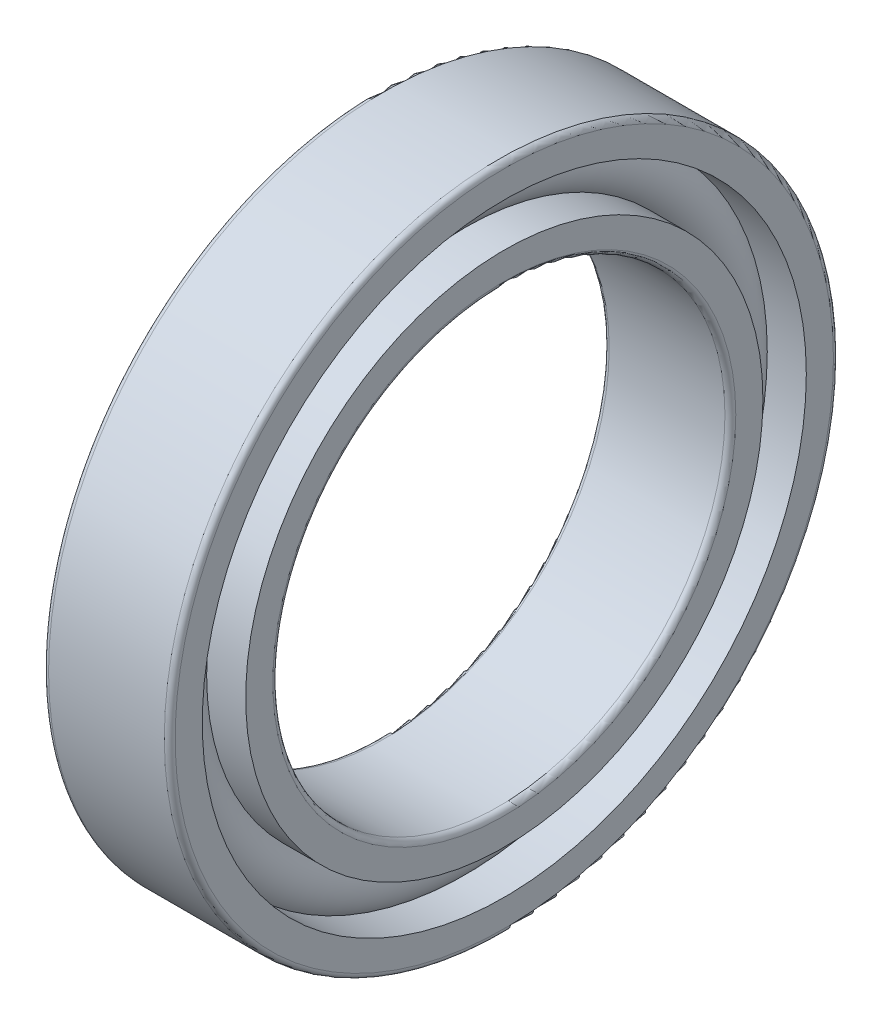
ISO-10303-21;
HEADER;
FILE_DESCRIPTION(('STEP AP214'),'2;1');
FILE_NAME('part.step','',(''),(''),'','','');
FILE_SCHEMA(('AUTOMOTIVE_DESIGN { 1 0 10303 214 1 1 1 1 }'));
ENDSEC;
DATA;
#1=APPLICATION_CONTEXT('core data for automotive mechanical design processes');
#2=APPLICATION_PROTOCOL_DEFINITION('international standard','automotive_design',2000,#1);
#3=PRODUCT_CONTEXT('',#1,'mechanical');
#4=PRODUCT('Part','Part','',(#3));
#5=PRODUCT_RELATED_PRODUCT_CATEGORY('part','',(#4));
#6=PRODUCT_DEFINITION_FORMATION('','',#4);
#7=PRODUCT_DEFINITION_CONTEXT('part definition',#1,'design');
#8=PRODUCT_DEFINITION('design','',#6,#7);
#9=PRODUCT_DEFINITION_SHAPE('','',#8);
#10=(LENGTH_UNIT() NAMED_UNIT(*) SI_UNIT(.MILLI.,.METRE.));
#11=(NAMED_UNIT(*) PLANE_ANGLE_UNIT() SI_UNIT($,.RADIAN.));
#12=(NAMED_UNIT(*) SI_UNIT($,.STERADIAN.) SOLID_ANGLE_UNIT());
#13=UNCERTAINTY_MEASURE_WITH_UNIT(LENGTH_MEASURE(1.E-05),#10,'distance_accuracy_value','');
#14=(GEOMETRIC_REPRESENTATION_CONTEXT(3) GLOBAL_UNCERTAINTY_ASSIGNED_CONTEXT((#13)) GLOBAL_UNIT_ASSIGNED_CONTEXT((#10,
#11,#12)) REPRESENTATION_CONTEXT('',''));
#15=CARTESIAN_POINT('',(0.,0.,0.));
#16=DIRECTION('',(0.,0.,1.));
#17=DIRECTION('',(1.,0.,0.));
#18=AXIS2_PLACEMENT_3D('',#15,#16,#17);
#19=CARTESIAN_POINT('',(0.,0.,0.));
#20=DIRECTION('',(-1.,0.,0.));
#21=DIRECTION('',(0.,0.,1.));
#22=AXIS2_PLACEMENT_3D('',#19,#20,#21);
#23=TOROIDAL_SURFACE('',#22,15.5,1.8);
#24=CARTESIAN_POINT('',(1.34164078649987,0.,0.));
#25=DIRECTION('',(-1.,0.,0.));
#26=DIRECTION('',(0.,0.,1.));
#27=AXIS2_PLACEMENT_3D('',#24,#25,#26);
#28=CIRCLE('',#27,16.7);
#29=CARTESIAN_POINT('',(1.34164078649987,0.,16.7));
#30=VERTEX_POINT('',#29);
#31=EDGE_CURVE('E34',#30,#30,#28,.F.);
#32=ORIENTED_EDGE('',*,*,#31,.T.);
#33=EDGE_LOOP('',(#32));
#34=FACE_BOUND('',#33,.T.);
#35=CARTESIAN_POINT('',(1.34164078649987,0.,0.));
#36=DIRECTION('',(-1.,0.,0.));
#37=DIRECTION('',(0.,0.,1.));
#38=AXIS2_PLACEMENT_3D('',#35,#36,#37);
#39=CIRCLE('',#38,14.3);
#40=CARTESIAN_POINT('',(1.34164078649987,0.,14.3));
#41=VERTEX_POINT('',#40);
#42=EDGE_CURVE('E10',#41,#41,#39,.T.);
#43=ORIENTED_EDGE('',*,*,#42,.T.);
#44=EDGE_LOOP('',(#43));
#45=FACE_BOUND('',#44,.T.);
#46=ADVANCED_FACE('F30',(#34,#45),#23,.T.);
#47=CARTESIAN_POINT('',(-20.6375,0.,0.));
#48=DIRECTION('',(1.,0.,0.));
#49=DIRECTION('',(0.,0.,-1.));
#50=AXIS2_PLACEMENT_3D('',#47,#48,#49);
#51=CYLINDRICAL_SURFACE('',#50,14.3);
#52=CARTESIAN_POINT('',(3.5,0.,0.));
#53=DIRECTION('',(1.,0.,0.));
#54=DIRECTION('',(0.,0.,-1.));
#55=AXIS2_PLACEMENT_3D('',#52,#53,#54);
#56=CIRCLE('',#55,14.3);
#57=CARTESIAN_POINT('',(3.5,0.,-14.3));
#58=VERTEX_POINT('',#57);
#59=EDGE_CURVE('E43',#58,#58,#56,.T.);
#60=ORIENTED_EDGE('',*,*,#59,.F.);
#61=EDGE_LOOP('',(#60));
#62=FACE_BOUND('',#61,.T.);
#63=ORIENTED_EDGE('',*,*,#42,.F.);
#64=EDGE_LOOP('',(#63));
#65=FACE_BOUND('',#64,.T.);
#66=ADVANCED_FACE('F82',(#62,#65),#51,.T.);
#67=CARTESIAN_POINT('',(-20.6375,0.,0.));
#68=DIRECTION('',(1.,0.,0.));
#69=DIRECTION('',(0.,0.,-1.));
#70=AXIS2_PLACEMENT_3D('',#67,#68,#69);
#71=CYLINDRICAL_SURFACE('',#70,14.3);
#72=CARTESIAN_POINT('',(-3.5,0.,0.));
#73=DIRECTION('',(1.,0.,0.));
#74=DIRECTION('',(0.,0.,-1.));
#75=AXIS2_PLACEMENT_3D('',#72,#73,#74);
#76=CIRCLE('',#75,14.3);
#77=CARTESIAN_POINT('',(-3.5,0.,-14.3));
#78=VERTEX_POINT('',#77);
#79=EDGE_CURVE('E52',#78,#78,#76,.T.);
#80=ORIENTED_EDGE('',*,*,#79,.T.);
#81=EDGE_LOOP('',(#80));
#82=FACE_BOUND('',#81,.T.);
#83=CARTESIAN_POINT('',(-1.34164078649987,0.,0.));
#84=DIRECTION('',(1.,0.,0.));
#85=DIRECTION('',(0.,0.,-1.));
#86=AXIS2_PLACEMENT_3D('',#83,#84,#85);
#87=CIRCLE('',#86,14.3);
#88=CARTESIAN_POINT('',(-1.34164078649987,0.,-14.3));
#89=VERTEX_POINT('',#88);
#90=EDGE_CURVE('E38',#89,#89,#87,.T.);
#91=ORIENTED_EDGE('',*,*,#90,.F.);
#92=EDGE_LOOP('',(#91));
#93=FACE_BOUND('',#92,.T.);
#94=ADVANCED_FACE('F85',(#82,#93),#71,.T.);
#95=CARTESIAN_POINT('',(3.5,12.8,0.));
#96=DIRECTION('',(1.,0.,0.));
#97=DIRECTION('',(0.,0.,-1.));
#98=AXIS2_PLACEMENT_3D('',#95,#96,#97);
#99=PLANE('',#98);
#100=ORIENTED_EDGE('',*,*,#59,.T.);
#101=EDGE_LOOP('',(#100));
#102=FACE_BOUND('',#101,.T.);
#103=CARTESIAN_POINT('',(3.5,0.,0.));
#104=DIRECTION('',(1.,0.,0.));
#105=DIRECTION('',(0.,0.,-1.));
#106=AXIS2_PLACEMENT_3D('',#103,#104,#105);
#107=CIRCLE('',#106,12.8);
#108=CARTESIAN_POINT('',(3.5,0.,-12.8));
#109=VERTEX_POINT('',#108);
#110=EDGE_CURVE('E74',#109,#109,#107,.T.);
#111=ORIENTED_EDGE('',*,*,#110,.F.);
#112=EDGE_LOOP('',(#111));
#113=FACE_BOUND('',#112,.T.);
#114=ADVANCED_FACE('F79',(#102,#113),#99,.T.);
#115=CARTESIAN_POINT('',(3.2,0.,0.));
#116=DIRECTION('',(1.,0.,0.));
#117=DIRECTION('',(0.,0.,-1.));
#118=AXIS2_PLACEMENT_3D('',#115,#116,#117);
#119=TOROIDAL_SURFACE('',#118,12.8,0.299999999999999);
#120=ORIENTED_EDGE('',*,*,#110,.T.);
#121=EDGE_LOOP('',(#120));
#122=FACE_BOUND('',#121,.T.);
#123=CARTESIAN_POINT('',(3.2,0.,0.));
#124=DIRECTION('',(1.,0.,0.));
#125=DIRECTION('',(0.,0.,-1.));
#126=AXIS2_PLACEMENT_3D('',#123,#124,#125);
#127=CIRCLE('',#126,12.5);
#128=CARTESIAN_POINT('',(3.2,0.,-12.5));
#129=VERTEX_POINT('',#128);
#130=EDGE_CURVE('E71',#129,#129,#127,.T.);
#131=ORIENTED_EDGE('',*,*,#130,.F.);
#132=EDGE_LOOP('',(#131));
#133=FACE_BOUND('',#132,.T.);
#134=ADVANCED_FACE('F96',(#122,#133),#119,.T.);
#135=CARTESIAN_POINT('',(-20.6375,0.,0.));
#136=DIRECTION('',(1.,0.,0.));
#137=DIRECTION('',(0.,0.,-1.));
#138=AXIS2_PLACEMENT_3D('',#135,#136,#137);
#139=CYLINDRICAL_SURFACE('',#138,12.5);
#140=ORIENTED_EDGE('',*,*,#130,.T.);
#141=EDGE_LOOP('',(#140));
#142=FACE_BOUND('',#141,.T.);
#143=CARTESIAN_POINT('',(-3.2,0.,0.));
#144=DIRECTION('',(1.,0.,0.));
#145=DIRECTION('',(0.,0.,-1.));
#146=AXIS2_PLACEMENT_3D('',#143,#144,#145);
#147=CIRCLE('',#146,12.5);
#148=CARTESIAN_POINT('',(-3.2,0.,-12.5));
#149=VERTEX_POINT('',#148);
#150=EDGE_CURVE('E68',#149,#149,#147,.T.);
#151=ORIENTED_EDGE('',*,*,#150,.F.);
#152=EDGE_LOOP('',(#151));
#153=FACE_BOUND('',#152,.T.);
#154=ADVANCED_FACE('F99',(#142,#153),#139,.F.);
#155=CARTESIAN_POINT('',(-3.2,0.,0.));
#156=DIRECTION('',(1.,0.,0.));
#157=DIRECTION('',(0.,0.,-1.));
#158=AXIS2_PLACEMENT_3D('',#155,#156,#157);
#159=TOROIDAL_SURFACE('',#158,12.8,0.299999999999999);
#160=ORIENTED_EDGE('',*,*,#150,.T.);
#161=EDGE_LOOP('',(#160));
#162=FACE_BOUND('',#161,.T.);
#163=CARTESIAN_POINT('',(-3.5,0.,0.));
#164=DIRECTION('',(1.,0.,0.));
#165=DIRECTION('',(0.,0.,-1.));
#166=AXIS2_PLACEMENT_3D('',#163,#164,#165);
#167=CIRCLE('',#166,12.8);
#168=CARTESIAN_POINT('',(-3.5,0.,-12.8));
#169=VERTEX_POINT('',#168);
#170=EDGE_CURVE('E65',#169,#169,#167,.T.);
#171=ORIENTED_EDGE('',*,*,#170,.F.);
#172=EDGE_LOOP('',(#171));
#173=FACE_BOUND('',#172,.T.);
#174=ADVANCED_FACE('F103',(#162,#173),#159,.T.);
#175=CARTESIAN_POINT('',(-3.5,14.3,0.));
#176=DIRECTION('',(-1.,0.,0.));
#177=DIRECTION('',(0.,0.,1.));
#178=AXIS2_PLACEMENT_3D('',#175,#176,#177);
#179=PLANE('',#178);
#180=ORIENTED_EDGE('',*,*,#170,.T.);
#181=EDGE_LOOP('',(#180));
#182=FACE_BOUND('',#181,.T.);
#183=ORIENTED_EDGE('',*,*,#79,.F.);
#184=EDGE_LOOP('',(#183));
#185=FACE_BOUND('',#184,.T.);
#186=ADVANCED_FACE('F107',(#182,#185),#179,.T.);
#187=CARTESIAN_POINT('',(-1.34164078649987,0.,0.));
#188=DIRECTION('',(1.,0.,0.));
#189=DIRECTION('',(0.,0.,-1.));
#190=AXIS2_PLACEMENT_3D('',#187,#188,#189);
#191=CIRCLE('',#190,16.7);
#192=CARTESIAN_POINT('',(-1.34164078649987,0.,-16.7));
#193=VERTEX_POINT('',#192);
#194=EDGE_CURVE('E46',#193,#193,#191,.F.);
#195=ORIENTED_EDGE('',*,*,#194,.T.);
#196=EDGE_LOOP('',(#195));
#197=FACE_BOUND('',#196,.T.);
#198=ORIENTED_EDGE('',*,*,#90,.T.);
#199=EDGE_LOOP('',(#198));
#200=FACE_BOUND('',#199,.T.);
#201=ADVANCED_FACE('F32',(#197,#200),#23,.T.);
#202=CARTESIAN_POINT('',(-20.6375,0.,0.));
#203=DIRECTION('',(1.,0.,0.));
#204=DIRECTION('',(0.,0.,-1.));
#205=AXIS2_PLACEMENT_3D('',#202,#203,#204);
#206=CYLINDRICAL_SURFACE('',#205,16.7);
#207=CARTESIAN_POINT('',(3.5,0.,0.));
#208=DIRECTION('',(1.,0.,0.));
#209=DIRECTION('',(0.,0.,-1.));
#210=AXIS2_PLACEMENT_3D('',#207,#208,#209);
#211=CIRCLE('',#210,16.7);
#212=CARTESIAN_POINT('',(3.5,0.,-16.7));
#213=VERTEX_POINT('',#212);
#214=EDGE_CURVE('E48',#213,#213,#211,.T.);
#215=ORIENTED_EDGE('',*,*,#214,.T.);
#216=EDGE_LOOP('',(#215));
#217=FACE_BOUND('',#216,.T.);
#218=ORIENTED_EDGE('',*,*,#31,.F.);
#219=EDGE_LOOP('',(#218));
#220=FACE_BOUND('',#219,.T.);
#221=ADVANCED_FACE('F112',(#217,#220),#206,.F.);
#222=CARTESIAN_POINT('',(-20.6375,0.,0.));
#223=DIRECTION('',(1.,0.,0.));
#224=DIRECTION('',(0.,0.,-1.));
#225=AXIS2_PLACEMENT_3D('',#222,#223,#224);
#226=CYLINDRICAL_SURFACE('',#225,16.7);
#227=CARTESIAN_POINT('',(-3.5,0.,0.));
#228=DIRECTION('',(1.,0.,0.));
#229=DIRECTION('',(0.,0.,-1.));
#230=AXIS2_PLACEMENT_3D('',#227,#228,#229);
#231=CIRCLE('',#230,16.7);
#232=CARTESIAN_POINT('',(-3.5,0.,-16.7));
#233=VERTEX_POINT('',#232);
#234=EDGE_CURVE('E143',#233,#233,#231,.T.);
#235=ORIENTED_EDGE('',*,*,#234,.F.);
#236=EDGE_LOOP('',(#235));
#237=FACE_BOUND('',#236,.T.);
#238=ORIENTED_EDGE('',*,*,#194,.F.);
#239=EDGE_LOOP('',(#238));
#240=FACE_BOUND('',#239,.T.);
#241=ADVANCED_FACE('F115',(#237,#240),#226,.F.);
#242=CARTESIAN_POINT('',(3.5,18.2,0.));
#243=DIRECTION('',(1.,0.,0.));
#244=DIRECTION('',(0.,0.,-1.));
#245=AXIS2_PLACEMENT_3D('',#242,#243,#244);
#246=PLANE('',#245);
#247=CARTESIAN_POINT('',(3.5,0.,0.));
#248=DIRECTION('',(1.,0.,0.));
#249=DIRECTION('',(0.,0.,-1.));
#250=AXIS2_PLACEMENT_3D('',#247,#248,#249);
#251=CIRCLE('',#250,18.2);
#252=CARTESIAN_POINT('',(3.5,0.,-18.2));
#253=VERTEX_POINT('',#252);
#254=EDGE_CURVE('E54',#253,#253,#251,.T.);
#255=ORIENTED_EDGE('',*,*,#254,.T.);
#256=EDGE_LOOP('',(#255));
#257=FACE_BOUND('',#256,.T.);
#258=ORIENTED_EDGE('',*,*,#214,.F.);
#259=EDGE_LOOP('',(#258));
#260=FACE_BOUND('',#259,.T.);
#261=ADVANCED_FACE('F116',(#257,#260),#246,.T.);
#262=CARTESIAN_POINT('',(3.2,0.,0.));
#263=DIRECTION('',(1.,0.,0.));
#264=DIRECTION('',(0.,0.,-1.));
#265=AXIS2_PLACEMENT_3D('',#262,#263,#264);
#266=TOROIDAL_SURFACE('',#265,18.2,0.300000000000001);
#267=CARTESIAN_POINT('',(3.2,0.,0.));
#268=DIRECTION('',(1.,0.,0.));
#269=DIRECTION('',(0.,0.,-1.));
#270=AXIS2_PLACEMENT_3D('',#267,#268,#269);
#271=CIRCLE('',#270,18.5);
#272=CARTESIAN_POINT('',(3.2,0.,-18.5));
#273=VERTEX_POINT('',#272);
#274=EDGE_CURVE('E59',#273,#273,#271,.T.);
#275=ORIENTED_EDGE('',*,*,#274,.T.);
#276=EDGE_LOOP('',(#275));
#277=FACE_BOUND('',#276,.T.);
#278=ORIENTED_EDGE('',*,*,#254,.F.);
#279=EDGE_LOOP('',(#278));
#280=FACE_BOUND('',#279,.T.);
#281=ADVANCED_FACE('F119',(#277,#280),#266,.T.);
#282=CARTESIAN_POINT('',(-20.6375,0.,0.));
#283=DIRECTION('',(1.,0.,0.));
#284=DIRECTION('',(0.,0.,-1.));
#285=AXIS2_PLACEMENT_3D('',#282,#283,#284);
#286=CYLINDRICAL_SURFACE('',#285,18.5);
#287=CARTESIAN_POINT('',(-3.2,0.,0.));
#288=DIRECTION('',(1.,0.,0.));
#289=DIRECTION('',(0.,0.,-1.));
#290=AXIS2_PLACEMENT_3D('',#287,#288,#289);
#291=CIRCLE('',#290,18.5);
#292=CARTESIAN_POINT('',(-3.2,0.,-18.5));
#293=VERTEX_POINT('',#292);
#294=EDGE_CURVE('E147',#293,#293,#291,.T.);
#295=ORIENTED_EDGE('',*,*,#294,.T.);
#296=EDGE_LOOP('',(#295));
#297=FACE_BOUND('',#296,.T.);
#298=ORIENTED_EDGE('',*,*,#274,.F.);
#299=EDGE_LOOP('',(#298));
#300=FACE_BOUND('',#299,.T.);
#301=ADVANCED_FACE('F123',(#297,#300),#286,.T.);
#302=CARTESIAN_POINT('',(-3.2,0.,0.));
#303=DIRECTION('',(1.,0.,0.));
#304=DIRECTION('',(0.,0.,-1.));
#305=AXIS2_PLACEMENT_3D('',#302,#303,#304);
#306=TOROIDAL_SURFACE('',#305,18.2,0.300000000000001);
#307=CARTESIAN_POINT('',(-3.5,0.,0.));
#308=DIRECTION('',(1.,0.,0.));
#309=DIRECTION('',(0.,0.,-1.));
#310=AXIS2_PLACEMENT_3D('',#307,#308,#309);
#311=CIRCLE('',#310,18.2);
#312=CARTESIAN_POINT('',(-3.5,0.,-18.2));
#313=VERTEX_POINT('',#312);
#314=EDGE_CURVE('E144',#313,#313,#311,.T.);
#315=ORIENTED_EDGE('',*,*,#314,.T.);
#316=EDGE_LOOP('',(#315));
#317=FACE_BOUND('',#316,.T.);
#318=ORIENTED_EDGE('',*,*,#294,.F.);
#319=EDGE_LOOP('',(#318));
#320=FACE_BOUND('',#319,.T.);
#321=ADVANCED_FACE('F127',(#317,#320),#306,.T.);
#322=CARTESIAN_POINT('',(-3.5,16.7,0.));
#323=DIRECTION('',(-1.,0.,0.));
#324=DIRECTION('',(0.,0.,1.));
#325=AXIS2_PLACEMENT_3D('',#322,#323,#324);
#326=PLANE('',#325);
#327=ORIENTED_EDGE('',*,*,#234,.T.);
#328=EDGE_LOOP('',(#327));
#329=FACE_BOUND('',#328,.T.);
#330=ORIENTED_EDGE('',*,*,#314,.F.);
#331=EDGE_LOOP('',(#330));
#332=FACE_BOUND('',#331,.T.);
#333=ADVANCED_FACE('F131',(#329,#332),#326,.T.);
#334=CLOSED_SHELL('',(#46,#66,#94,#114,#134,#154,#174,#186,#201,#221,#241,#261,#281,#301,#321,#333));
#335=MANIFOLD_SOLID_BREP('B2',#334);
#336=ADVANCED_BREP_SHAPE_REPRESENTATION('',(#18,#335),#14);
#337=SHAPE_DEFINITION_REPRESENTATION(#9,#336);
ENDSEC;
END-ISO-10303-21;
